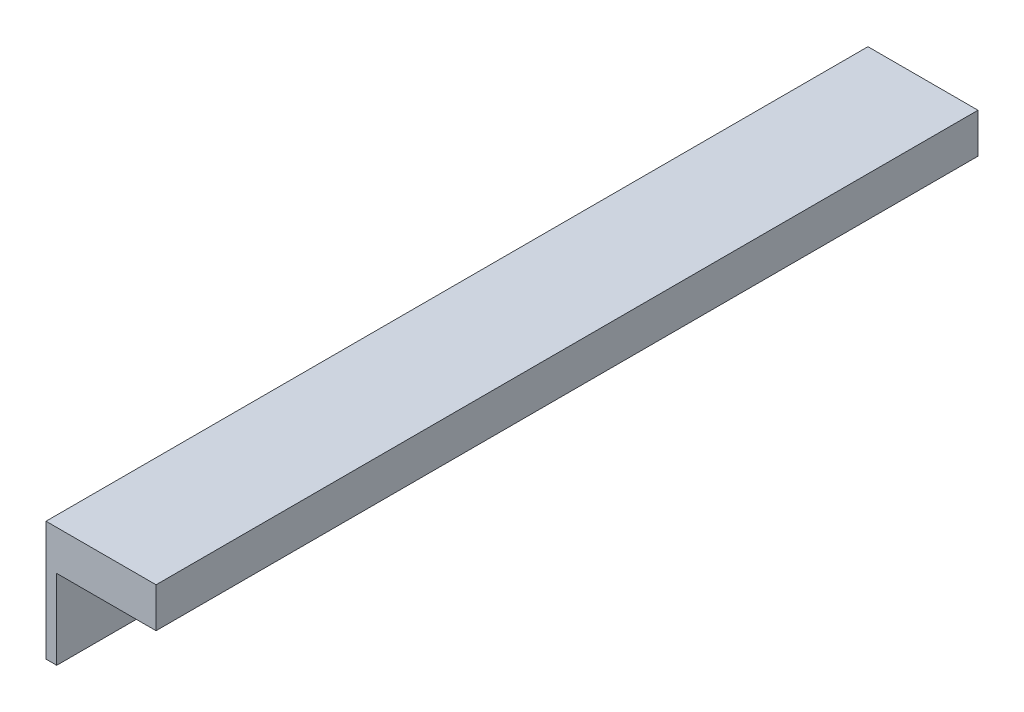
ISO-10303-21;
HEADER;
FILE_DESCRIPTION(('STEP AP214'),'2;1');
FILE_NAME('part.step','',(''),(''),'','','');
FILE_SCHEMA(('AUTOMOTIVE_DESIGN { 1 0 10303 214 1 1 1 1 }'));
ENDSEC;
DATA;
#1=APPLICATION_CONTEXT('core data for automotive mechanical design processes');
#2=APPLICATION_PROTOCOL_DEFINITION('international standard','automotive_design',2000,#1);
#3=PRODUCT_CONTEXT('',#1,'mechanical');
#4=PRODUCT('Part','Part','',(#3));
#5=PRODUCT_RELATED_PRODUCT_CATEGORY('part','',(#4));
#6=PRODUCT_DEFINITION_FORMATION('','',#4);
#7=PRODUCT_DEFINITION_CONTEXT('part definition',#1,'design');
#8=PRODUCT_DEFINITION('design','',#6,#7);
#9=PRODUCT_DEFINITION_SHAPE('','',#8);
#10=(LENGTH_UNIT() NAMED_UNIT(*) SI_UNIT(.MILLI.,.METRE.));
#11=(NAMED_UNIT(*) PLANE_ANGLE_UNIT() SI_UNIT($,.RADIAN.));
#12=(NAMED_UNIT(*) SI_UNIT($,.STERADIAN.) SOLID_ANGLE_UNIT());
#13=UNCERTAINTY_MEASURE_WITH_UNIT(LENGTH_MEASURE(1.E-05),#10,'distance_accuracy_value','');
#14=(GEOMETRIC_REPRESENTATION_CONTEXT(3) GLOBAL_UNCERTAINTY_ASSIGNED_CONTEXT((#13)) GLOBAL_UNIT_ASSIGNED_CONTEXT((#10,
#11,#12)) REPRESENTATION_CONTEXT('',''));
#15=CARTESIAN_POINT('',(0.,0.,0.));
#16=DIRECTION('',(0.,0.,1.));
#17=DIRECTION('',(1.,0.,0.));
#18=AXIS2_PLACEMENT_3D('',#15,#16,#17);
#19=CARTESIAN_POINT('',(-54.7619801246486,2.,-30.9683720930233));
#20=DIRECTION('',(0.,0.,1.));
#21=DIRECTION('',(1.,0.,0.));
#22=AXIS2_PLACEMENT_3D('',#19,#20,#21);
#23=PLANE('',#22);
#24=DIRECTION('',(0.,1.,0.));
#25=VECTOR('',#24,1.);
#26=CARTESIAN_POINT('',(-55.5705360459158,-6.,-30.9683720930233));
#27=LINE('',#26,#25);
#28=CARTESIAN_POINT('',(-55.5705360459158,-6.,-30.9683720930233));
#29=VERTEX_POINT('',#28);
#30=CARTESIAN_POINT('',(-55.5705360459158,3.,-30.9683720930233));
#31=VERTEX_POINT('',#30);
#32=EDGE_CURVE('E110',#29,#31,#27,.T.);
#33=ORIENTED_EDGE('',*,*,#32,.T.);
#34=DIRECTION('',(-1.,0.,0.));
#35=VECTOR('',#34,1.);
#36=CARTESIAN_POINT('',(-55.5705360459158,3.,-30.9683720930233));
#37=LINE('',#36,#35);
#38=CARTESIAN_POINT('',(-47.2762547000235,3.,-30.9683720930233));
#39=VERTEX_POINT('',#38);
#40=EDGE_CURVE('E124',#39,#31,#37,.T.);
#41=ORIENTED_EDGE('',*,*,#40,.F.);
#42=DIRECTION('',(0.,1.,0.));
#43=VECTOR('',#42,1.);
#44=CARTESIAN_POINT('',(-47.2762547000235,-8.,-30.9683720930233));
#45=LINE('',#44,#43);
#46=CARTESIAN_POINT('',(-47.2762547000235,0.,-30.9683720930233));
#47=VERTEX_POINT('',#46);
#48=EDGE_CURVE('E154',#47,#39,#45,.T.);
#49=ORIENTED_EDGE('',*,*,#48,.F.);
#50=DIRECTION('',(-1.,0.,0.));
#51=VECTOR('',#50,1.);
#52=CARTESIAN_POINT('',(-54.7619801246486,0.,-30.9683720930233));
#53=LINE('',#52,#51);
#54=CARTESIAN_POINT('',(-54.7619801246486,0.,-30.9683720930233));
#55=VERTEX_POINT('',#54);
#56=EDGE_CURVE('E67',#47,#55,#53,.T.);
#57=ORIENTED_EDGE('',*,*,#56,.T.);
#58=DIRECTION('',(0.,1.,0.));
#59=VECTOR('',#58,1.);
#60=CARTESIAN_POINT('',(-54.7619801246486,-6.,-30.9683720930233));
#61=LINE('',#60,#59);
#62=CARTESIAN_POINT('',(-54.7619801246486,-6.,-30.9683720930233));
#63=VERTEX_POINT('',#62);
#64=EDGE_CURVE('E151',#63,#55,#61,.T.);
#65=ORIENTED_EDGE('',*,*,#64,.F.);
#66=DIRECTION('',(-1.,0.,0.));
#67=VECTOR('',#66,1.);
#68=CARTESIAN_POINT('',(-54.7619801246486,-6.,-30.9683720930233));
#69=LINE('',#68,#67);
#70=EDGE_CURVE('E142',#63,#29,#69,.T.);
#71=ORIENTED_EDGE('',*,*,#70,.T.);
#72=EDGE_LOOP('',(#33,#41,#49,#57,#65,#71));
#73=FACE_BOUND('',#72,.T.);
#74=ADVANCED_FACE('F45',(#73),#23,.F.);
#75=CARTESIAN_POINT('',(-54.7619801246486,2.,30.9683720930233));
#76=DIRECTION('',(0.,0.,-1.));
#77=DIRECTION('',(-1.,0.,0.));
#78=AXIS2_PLACEMENT_3D('',#75,#76,#77);
#79=PLANE('',#78);
#80=DIRECTION('',(1.,0.,0.));
#81=VECTOR('',#80,1.);
#82=CARTESIAN_POINT('',(-54.7619801246486,0.,30.9683720930233));
#83=LINE('',#82,#81);
#84=CARTESIAN_POINT('',(-54.7619801246486,0.,30.9683720930233));
#85=VERTEX_POINT('',#84);
#86=CARTESIAN_POINT('',(-47.2762547000235,0.,30.9683720930233));
#87=VERTEX_POINT('',#86);
#88=EDGE_CURVE('E53',#85,#87,#83,.T.);
#89=ORIENTED_EDGE('',*,*,#88,.T.);
#90=DIRECTION('',(0.,1.,0.));
#91=VECTOR('',#90,1.);
#92=CARTESIAN_POINT('',(-47.2762547000235,-8.,30.9683720930233));
#93=LINE('',#92,#91);
#94=CARTESIAN_POINT('',(-47.2762547000235,3.,30.9683720930233));
#95=VERTEX_POINT('',#94);
#96=EDGE_CURVE('E60',#87,#95,#93,.T.);
#97=ORIENTED_EDGE('',*,*,#96,.T.);
#98=DIRECTION('',(1.,0.,0.));
#99=VECTOR('',#98,1.);
#100=CARTESIAN_POINT('',(-47.2762547000235,3.,30.9683720930233));
#101=LINE('',#100,#99);
#102=CARTESIAN_POINT('',(-55.5705360459158,3.,30.9683720930233));
#103=VERTEX_POINT('',#102);
#104=EDGE_CURVE('E113',#103,#95,#101,.T.);
#105=ORIENTED_EDGE('',*,*,#104,.F.);
#106=DIRECTION('',(0.,1.,0.));
#107=VECTOR('',#106,1.);
#108=CARTESIAN_POINT('',(-55.5705360459158,-6.,30.9683720930233));
#109=LINE('',#108,#107);
#110=CARTESIAN_POINT('',(-55.5705360459158,-6.,30.9683720930233));
#111=VERTEX_POINT('',#110);
#112=EDGE_CURVE('E98',#111,#103,#109,.T.);
#113=ORIENTED_EDGE('',*,*,#112,.F.);
#114=DIRECTION('',(1.,0.,0.));
#115=VECTOR('',#114,1.);
#116=CARTESIAN_POINT('',(-55.5705360459158,-6.,30.9683720930233));
#117=LINE('',#116,#115);
#118=CARTESIAN_POINT('',(-54.7619801246486,-6.,30.9683720930233));
#119=VERTEX_POINT('',#118);
#120=EDGE_CURVE('E148',#111,#119,#117,.T.);
#121=ORIENTED_EDGE('',*,*,#120,.T.);
#122=DIRECTION('',(0.,1.,0.));
#123=VECTOR('',#122,1.);
#124=CARTESIAN_POINT('',(-54.7619801246486,-6.,30.9683720930233));
#125=LINE('',#124,#123);
#126=EDGE_CURVE('E109',#119,#85,#125,.T.);
#127=ORIENTED_EDGE('',*,*,#126,.T.);
#128=EDGE_LOOP('',(#89,#97,#105,#113,#121,#127));
#129=FACE_BOUND('',#128,.T.);
#130=ADVANCED_FACE('F115',(#129),#79,.F.);
#131=CARTESIAN_POINT('',(0.,0.,0.));
#132=DIRECTION('',(0.,1.,0.));
#133=DIRECTION('',(0.,0.,1.));
#134=AXIS2_PLACEMENT_3D('',#131,#132,#133);
#135=PLANE('',#134);
#136=CARTESIAN_POINT('',(-50.8148653512495,0.,26.4777845266858));
#137=DIRECTION('',(0.,-1.,0.));
#138=DIRECTION('',(0.,0.,-1.));
#139=AXIS2_PLACEMENT_3D('',#136,#137,#138);
#140=CIRCLE('',#139,2.4);
#141=CARTESIAN_POINT('',(-50.8148653512495,0.,24.0777845266858));
#142=VERTEX_POINT('',#141);
#143=EDGE_CURVE('E163',#142,#142,#140,.T.);
#144=ORIENTED_EDGE('',*,*,#143,.F.);
#145=EDGE_LOOP('',(#144));
#146=FACE_BOUND('',#145,.T.);
#147=CARTESIAN_POINT('',(-50.8148653512495,0.,-26.4777845266858));
#148=DIRECTION('',(0.,1.,0.));
#149=DIRECTION('',(0.,0.,1.));
#150=AXIS2_PLACEMENT_3D('',#147,#148,#149);
#151=CIRCLE('',#150,2.4);
#152=CARTESIAN_POINT('',(-50.8148653512495,0.,-24.0777845266858));
#153=VERTEX_POINT('',#152);
#154=EDGE_CURVE('E169',#153,#153,#151,.T.);
#155=ORIENTED_EDGE('',*,*,#154,.T.);
#156=EDGE_LOOP('',(#155));
#157=FACE_BOUND('',#156,.T.);
#158=ORIENTED_EDGE('',*,*,#56,.F.);
#159=DIRECTION('',(0.,0.,1.));
#160=VECTOR('',#159,1.);
#161=CARTESIAN_POINT('',(-47.2762547000235,0.,0.));
#162=LINE('',#161,#160);
#163=EDGE_CURVE('E11',#47,#87,#162,.T.);
#164=ORIENTED_EDGE('',*,*,#163,.T.);
#165=ORIENTED_EDGE('',*,*,#88,.F.);
#166=DIRECTION('',(0.,0.,1.));
#167=VECTOR('',#166,1.);
#168=CARTESIAN_POINT('',(-54.7619801246486,0.,-30.9683720930233));
#169=LINE('',#168,#167);
#170=EDGE_CURVE('E175',#55,#85,#169,.T.);
#171=ORIENTED_EDGE('',*,*,#170,.F.);
#172=EDGE_LOOP('',(#158,#164,#165,#171));
#173=FACE_BOUND('',#172,.T.);
#174=ADVANCED_FACE('F180',(#146,#157,#173),#135,.F.);
#175=CARTESIAN_POINT('',(-50.8148653512495,0.,-26.4777845266858));
#176=DIRECTION('',(0.,1.,0.));
#177=DIRECTION('',(0.,0.,1.));
#178=AXIS2_PLACEMENT_3D('',#175,#176,#177);
#179=CYLINDRICAL_SURFACE('',#178,2.4);
#180=ORIENTED_EDGE('',*,*,#154,.F.);
#181=EDGE_LOOP('',(#180));
#182=FACE_BOUND('',#181,.T.);
#183=CARTESIAN_POINT('',(-50.8148653512495,2.5,-26.4777845266858));
#184=DIRECTION('',(0.,-1.,0.));
#185=DIRECTION('',(0.,0.,-1.));
#186=AXIS2_PLACEMENT_3D('',#183,#184,#185);
#187=CIRCLE('',#186,2.4);
#188=CARTESIAN_POINT('',(-50.8148653512495,2.5,-28.8777845266858));
#189=VERTEX_POINT('',#188);
#190=EDGE_CURVE('E126',#189,#189,#187,.T.);
#191=ORIENTED_EDGE('',*,*,#190,.F.);
#192=EDGE_LOOP('',(#191));
#193=FACE_BOUND('',#192,.T.);
#194=ADVANCED_FACE('F205',(#182,#193),#179,.F.);
#195=CARTESIAN_POINT('',(-50.8148653512495,0.,26.4777845266858));
#196=DIRECTION('',(0.,1.,0.));
#197=DIRECTION('',(0.,0.,1.));
#198=AXIS2_PLACEMENT_3D('',#195,#196,#197);
#199=CYLINDRICAL_SURFACE('',#198,2.4);
#200=ORIENTED_EDGE('',*,*,#143,.T.);
#201=EDGE_LOOP('',(#200));
#202=FACE_BOUND('',#201,.T.);
#203=CARTESIAN_POINT('',(-50.8148653512495,2.5,26.4777845266858));
#204=DIRECTION('',(0.,-1.,0.));
#205=DIRECTION('',(0.,0.,-1.));
#206=AXIS2_PLACEMENT_3D('',#203,#204,#205);
#207=CIRCLE('',#206,2.4);
#208=CARTESIAN_POINT('',(-50.8148653512495,2.5,24.0777845266858));
#209=VERTEX_POINT('',#208);
#210=EDGE_CURVE('E130',#209,#209,#207,.T.);
#211=ORIENTED_EDGE('',*,*,#210,.F.);
#212=EDGE_LOOP('',(#211));
#213=FACE_BOUND('',#212,.T.);
#214=ADVANCED_FACE('F211',(#202,#213),#199,.F.);
#215=CARTESIAN_POINT('',(-47.2762547000235,-8.,-30.9683720930233));
#216=DIRECTION('',(-1.,0.,0.));
#217=DIRECTION('',(0.,0.,1.));
#218=AXIS2_PLACEMENT_3D('',#215,#216,#217);
#219=PLANE('',#218);
#220=ORIENTED_EDGE('',*,*,#48,.T.);
#221=DIRECTION('',(0.,0.,-1.));
#222=VECTOR('',#221,1.);
#223=CARTESIAN_POINT('',(-47.2762547000235,3.,-30.9683720930233));
#224=LINE('',#223,#222);
#225=EDGE_CURVE('E119',#95,#39,#224,.T.);
#226=ORIENTED_EDGE('',*,*,#225,.F.);
#227=ORIENTED_EDGE('',*,*,#96,.F.);
#228=ORIENTED_EDGE('',*,*,#163,.F.);
#229=EDGE_LOOP('',(#220,#226,#227,#228));
#230=FACE_BOUND('',#229,.T.);
#231=ADVANCED_FACE('F215',(#230),#219,.F.);
#232=CARTESIAN_POINT('',(-54.7619801246486,-6.,30.9683720930233));
#233=DIRECTION('',(1.,0.,0.));
#234=DIRECTION('',(0.,0.,-1.));
#235=AXIS2_PLACEMENT_3D('',#232,#233,#234);
#236=PLANE('',#235);
#237=ORIENTED_EDGE('',*,*,#64,.T.);
#238=ORIENTED_EDGE('',*,*,#170,.T.);
#239=ORIENTED_EDGE('',*,*,#126,.F.);
#240=DIRECTION('',(0.,0.,-1.));
#241=VECTOR('',#240,1.);
#242=CARTESIAN_POINT('',(-54.7619801246486,-6.,30.9683720930233));
#243=LINE('',#242,#241);
#244=EDGE_CURVE('E138',#119,#63,#243,.T.);
#245=ORIENTED_EDGE('',*,*,#244,.T.);
#246=EDGE_LOOP('',(#237,#238,#239,#245));
#247=FACE_BOUND('',#246,.T.);
#248=ADVANCED_FACE('F182',(#247),#236,.T.);
#249=CARTESIAN_POINT('',(-55.5705360459158,-6.,-30.9683720930233));
#250=DIRECTION('',(-1.,0.,0.));
#251=DIRECTION('',(0.,0.,1.));
#252=AXIS2_PLACEMENT_3D('',#249,#250,#251);
#253=PLANE('',#252);
#254=ORIENTED_EDGE('',*,*,#112,.T.);
#255=DIRECTION('',(0.,0.,1.));
#256=VECTOR('',#255,1.);
#257=CARTESIAN_POINT('',(-55.5705360459158,3.,30.9683720930233));
#258=LINE('',#257,#256);
#259=EDGE_CURVE('E102',#31,#103,#258,.T.);
#260=ORIENTED_EDGE('',*,*,#259,.F.);
#261=ORIENTED_EDGE('',*,*,#32,.F.);
#262=DIRECTION('',(0.,0.,1.));
#263=VECTOR('',#262,1.);
#264=CARTESIAN_POINT('',(-55.5705360459158,-6.,-30.9683720930233));
#265=LINE('',#264,#263);
#266=EDGE_CURVE('E104',#29,#111,#265,.T.);
#267=ORIENTED_EDGE('',*,*,#266,.T.);
#268=EDGE_LOOP('',(#254,#260,#261,#267));
#269=FACE_BOUND('',#268,.T.);
#270=ADVANCED_FACE('F100',(#269),#253,.T.);
#271=CARTESIAN_POINT('',(0.,-6.,0.));
#272=DIRECTION('',(0.,1.,0.));
#273=DIRECTION('',(0.,0.,1.));
#274=AXIS2_PLACEMENT_3D('',#271,#272,#273);
#275=PLANE('',#274);
#276=ORIENTED_EDGE('',*,*,#244,.F.);
#277=ORIENTED_EDGE('',*,*,#120,.F.);
#278=ORIENTED_EDGE('',*,*,#266,.F.);
#279=ORIENTED_EDGE('',*,*,#70,.F.);
#280=EDGE_LOOP('',(#276,#277,#278,#279));
#281=FACE_BOUND('',#280,.T.);
#282=ADVANCED_FACE('F186',(#281),#275,.F.);
#283=CARTESIAN_POINT('',(0.,3.,0.));
#284=DIRECTION('',(0.,-1.,0.));
#285=DIRECTION('',(0.,0.,-1.));
#286=AXIS2_PLACEMENT_3D('',#283,#284,#285);
#287=PLANE('',#286);
#288=ORIENTED_EDGE('',*,*,#259,.T.);
#289=ORIENTED_EDGE('',*,*,#104,.T.);
#290=ORIENTED_EDGE('',*,*,#225,.T.);
#291=ORIENTED_EDGE('',*,*,#40,.T.);
#292=EDGE_LOOP('',(#288,#289,#290,#291));
#293=FACE_BOUND('',#292,.T.);
#294=ADVANCED_FACE('F122',(#293),#287,.F.);
#295=CARTESIAN_POINT('',(-50.8148653512495,2.5,26.4777845266858));
#296=DIRECTION('',(0.,-1.,0.));
#297=DIRECTION('',(0.,0.,-1.));
#298=AXIS2_PLACEMENT_3D('',#295,#296,#297);
#299=PLANE('',#298);
#300=ORIENTED_EDGE('',*,*,#210,.T.);
#301=EDGE_LOOP('',(#300));
#302=FACE_BOUND('',#301,.T.);
#303=ADVANCED_FACE('F194',(#302),#299,.T.);
#304=CARTESIAN_POINT('',(-50.8148653512495,2.5,-26.4777845266858));
#305=DIRECTION('',(0.,-1.,0.));
#306=DIRECTION('',(0.,0.,-1.));
#307=AXIS2_PLACEMENT_3D('',#304,#305,#306);
#308=PLANE('',#307);
#309=ORIENTED_EDGE('',*,*,#190,.T.);
#310=EDGE_LOOP('',(#309));
#311=FACE_BOUND('',#310,.T.);
#312=ADVANCED_FACE('F297',(#311),#308,.T.);
#313=CLOSED_SHELL('',(#74,#130,#174,#194,#214,#231,#248,#270,#282,#294,#303,#312));
#314=MANIFOLD_SOLID_BREP('B2',#313);
#315=ADVANCED_BREP_SHAPE_REPRESENTATION('',(#18,#314),#14);
#316=SHAPE_DEFINITION_REPRESENTATION(#9,#315);
ENDSEC;
END-ISO-10303-21;
